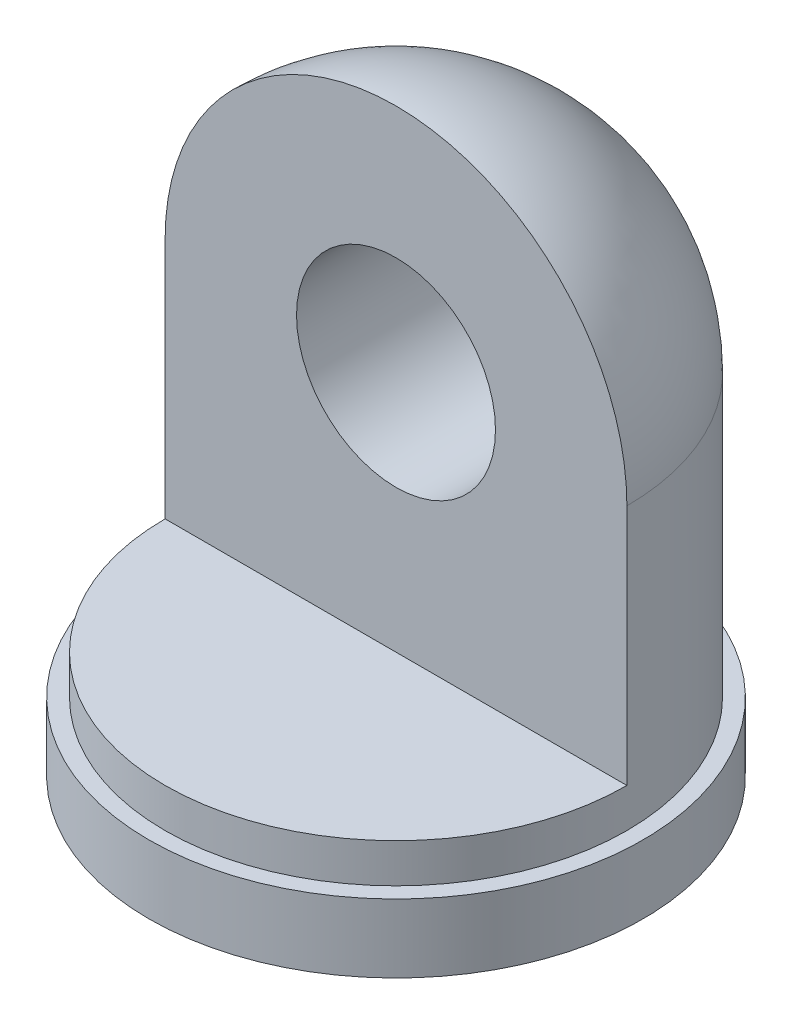
ISO-10303-21;
HEADER;
FILE_DESCRIPTION(('STEP AP214'),'2;1');
FILE_NAME('part.step','',(''),(''),'','','');
FILE_SCHEMA(('AUTOMOTIVE_DESIGN { 1 0 10303 214 1 1 1 1 }'));
ENDSEC;
DATA;
#1=APPLICATION_CONTEXT('core data for automotive mechanical design processes');
#2=APPLICATION_PROTOCOL_DEFINITION('international standard','automotive_design',2000,#1);
#3=PRODUCT_CONTEXT('',#1,'mechanical');
#4=PRODUCT('Part','Part','',(#3));
#5=PRODUCT_RELATED_PRODUCT_CATEGORY('part','',(#4));
#6=PRODUCT_DEFINITION_FORMATION('','',#4);
#7=PRODUCT_DEFINITION_CONTEXT('part definition',#1,'design');
#8=PRODUCT_DEFINITION('design','',#6,#7);
#9=PRODUCT_DEFINITION_SHAPE('','',#8);
#10=(LENGTH_UNIT() NAMED_UNIT(*) SI_UNIT(.MILLI.,.METRE.));
#11=(NAMED_UNIT(*) PLANE_ANGLE_UNIT() SI_UNIT($,.RADIAN.));
#12=(NAMED_UNIT(*) SI_UNIT($,.STERADIAN.) SOLID_ANGLE_UNIT());
#13=UNCERTAINTY_MEASURE_WITH_UNIT(LENGTH_MEASURE(1.E-05),#10,'distance_accuracy_value','');
#14=(GEOMETRIC_REPRESENTATION_CONTEXT(3) GLOBAL_UNCERTAINTY_ASSIGNED_CONTEXT((#13)) GLOBAL_UNIT_ASSIGNED_CONTEXT((#10,
#11,#12)) REPRESENTATION_CONTEXT('',''));
#15=CARTESIAN_POINT('',(0.,0.,0.));
#16=DIRECTION('',(0.,0.,1.));
#17=DIRECTION('',(1.,0.,0.));
#18=AXIS2_PLACEMENT_3D('',#15,#16,#17);
#19=CARTESIAN_POINT('',(0.,12.2932693034272,0.));
#20=DIRECTION('',(0.,1.,0.));
#21=DIRECTION('',(0.,0.,1.));
#22=AXIS2_PLACEMENT_3D('',#19,#20,#21);
#23=CYLINDRICAL_SURFACE('',#22,6.);
#24=CARTESIAN_POINT('',(2.58487319345415,6.29326930342722,-5.41464962613114));
#25=CARTESIAN_POINT('',(2.5848840410391,6.22424858018242,-5.41463377199758));
#26=CARTESIAN_POINT('',(2.58210904828782,6.15523652136865,-5.41596894936315));
#27=CARTESIAN_POINT('',(2.57107232171774,6.01778124345002,-5.42122265093839));
#28=CARTESIAN_POINT('',(2.56281301861613,5.94933778593468,-5.42514003067699));
#29=CARTESIAN_POINT('',(2.54094113834099,5.81381070570679,-5.43541674978779));
#30=CARTESIAN_POINT('',(2.52735249319485,5.74672239450183,-5.44176516932781));
#31=CARTESIAN_POINT('',(2.49498189353482,5.61407765387016,-5.45668230331635));
#32=CARTESIAN_POINT('',(2.47619954852882,5.54852134002988,-5.46525118470886));
#33=CARTESIAN_POINT('',(2.41238215227121,5.35498387763034,-5.49386967397398));
#34=CARTESIAN_POINT('',(2.35982624648252,5.2298266257317,-5.51685639491123));
#35=CARTESIAN_POINT('',(2.2363827259697,4.99003901975938,-5.56803706560118));
#36=CARTESIAN_POINT('',(2.16547452046273,4.87542068710021,-5.59623685405351));
#37=CARTESIAN_POINT('',(2.0023514088534,4.6524307139157,-5.65672946665363));
#38=CARTESIAN_POINT('',(1.90911532601506,4.5448434496154,-5.68916624477941));
#39=CARTESIAN_POINT('',(1.70614103023118,4.34626565715367,-5.75329509527709));
#40=CARTESIAN_POINT('',(1.59639915713031,4.25527882006174,-5.78498700066679));
#41=CARTESIAN_POINT('',(1.35718295533805,4.08830400020744,-5.84585056834115));
#42=CARTESIAN_POINT('',(1.22702334567552,4.01322264251166,-5.87483361089336));
#43=CARTESIAN_POINT('',(0.954445590874337,3.88636908924252,-5.92521695380403));
#44=CARTESIAN_POINT('',(0.812033323049155,3.83458579157461,-5.94662086476603));
#45=CARTESIAN_POINT('',(0.527327249450271,3.75871129120959,-5.97840237800325));
#46=CARTESIAN_POINT('',(0.385460584817764,3.73324963072621,-5.98932327199135));
#47=CARTESIAN_POINT('',(0.0990742136641104,3.70629920036736,-6.00089048993073));
#48=CARTESIAN_POINT('',(-0.0454443598204628,3.70480042051561,-6.00154110406835));
#49=CARTESIAN_POINT('',(-0.323014067783129,3.72513069346394,-5.99280425769664));
#50=CARTESIAN_POINT('',(-0.456200150087038,3.74545026036471,-5.98406631198313));
#51=CARTESIAN_POINT('',(-0.717053911297214,3.80623456379425,-5.95844074933576));
#52=CARTESIAN_POINT('',(-0.844721281432467,3.84670042592341,-5.94155267704506));
#53=CARTESIAN_POINT('',(-1.09327832274163,3.9470895272948,-5.90092010836288));
#54=CARTESIAN_POINT('',(-1.21403435085097,4.00730109169824,-5.87707462723402));
#55=CARTESIAN_POINT('',(-1.44404792068695,4.1451788378233,-5.82483114306816));
#56=CARTESIAN_POINT('',(-1.55330115050488,4.22285153101315,-5.7964314428427));
#57=CARTESIAN_POINT('',(-1.76586685162216,4.40016587287919,-5.73540220447574));
#58=CARTESIAN_POINT('',(-1.86812936916187,4.50101356623946,-5.70261516897747));
#59=CARTESIAN_POINT('',(-2.0547768350895,4.71846629078323,-5.63805531104916));
#60=CARTESIAN_POINT('',(-2.1391518137535,4.83508005029034,-5.60628306255109));
#61=CARTESIAN_POINT('',(-2.29061845889676,5.08623015576656,-5.5461671427034));
#62=CARTESIAN_POINT('',(-2.35693845175716,5.22127650746231,-5.51799792851949));
#63=CARTESIAN_POINT('',(-2.46538636243553,5.50207627564986,-5.47041338501155));
#64=CARTESIAN_POINT('',(-2.50756056017947,5.64780860127627,-5.45098132475776));
#65=CARTESIAN_POINT('',(-2.55266760594347,5.87806786165184,-5.42993422919482));
#66=CARTESIAN_POINT('',(-2.56472041746477,5.96053329271925,-5.42423612340741));
#67=CARTESIAN_POINT('',(-2.58082861822633,6.1264026475209,-5.41658142561293));
#68=CARTESIAN_POINT('',(-2.5848848140309,6.20980647575186,-5.41462445626345));
#69=CARTESIAN_POINT('',(-2.58487319345415,6.29326930342722,-5.41464962613114));
#70=B_SPLINE_CURVE_WITH_KNOTS('',3,(#24,#25,#26,#27,#28,#29,#30,#31,#32,#33,#34,#35,#36,#37,#38,
#39,#40,#41,#42,#43,#44,#45,#46,#47,#48,#49,#50,#51,#52,#53,#54,#55,#56,#57,#58,#59,#60,#61,#62,
#63,#64,#65,#66,#67,#68,#69),.UNSPECIFIED.,.F.,.F.,(4,2,2,2,2,2,2,2,2,2,2,2,2,2,2,2,2,2,2,2,2,2,
4),(0.,0.206979139837886,0.413866605023873,0.619835464324268,0.825819813756001,1.23686214291858,
1.64836766487108,2.0845006846086,2.52073055972405,2.97747599919997,3.43400355719699,
3.86533827417413,4.2964928056714,4.69963144163562,5.10279260402143,5.51212434384899,
5.92160898244336,6.36161836629248,6.80187235090698,7.25872710265807,7.71470324996145,
7.96488473655777,8.21504098775574),.UNSPECIFIED.);
#71=CARTESIAN_POINT('',(2.58487319345415,6.29326930342722,-5.41464962613114));
#72=VERTEX_POINT('',#71);
#73=CARTESIAN_POINT('',(-2.58487319345415,6.29326930342722,-5.41464962613114));
#74=VERTEX_POINT('',#73);
#75=EDGE_CURVE('E48',#72,#74,#70,.T.);
#76=ORIENTED_EDGE('',*,*,#75,.F.);
#77=CARTESIAN_POINT('',(0.,6.29326930342722,0.));
#78=DIRECTION('',(0.,1.,0.));
#79=DIRECTION('',(0.,0.,1.));
#80=AXIS2_PLACEMENT_3D('',#77,#78,#79);
#81=CIRCLE('',#80,6.);
#82=CARTESIAN_POINT('',(6.,6.29326930342722,0.));
#83=VERTEX_POINT('',#82);
#84=EDGE_CURVE('E11',#83,#72,#81,.T.);
#85=ORIENTED_EDGE('',*,*,#84,.F.);
#86=DIRECTION('',(0.,-1.,0.));
#87=VECTOR('',#86,1.);
#88=CARTESIAN_POINT('',(6.,0.,0.));
#89=LINE('',#88,#87);
#90=CARTESIAN_POINT('',(6.,0.,0.));
#91=VERTEX_POINT('',#90);
#92=EDGE_CURVE('E56',#83,#91,#89,.T.);
#93=ORIENTED_EDGE('',*,*,#92,.T.);
#94=CARTESIAN_POINT('',(0.,0.,0.));
#95=DIRECTION('',(0.,-1.,0.));
#96=DIRECTION('',(0.,0.,-1.));
#97=AXIS2_PLACEMENT_3D('',#94,#95,#96);
#98=CIRCLE('',#97,6.);
#99=CARTESIAN_POINT('',(-6.,0.,0.));
#100=VERTEX_POINT('',#99);
#101=EDGE_CURVE('E100',#91,#100,#98,.T.);
#102=ORIENTED_EDGE('',*,*,#101,.T.);
#103=DIRECTION('',(0.,-1.,0.));
#104=VECTOR('',#103,1.);
#105=CARTESIAN_POINT('',(-6.,0.,0.));
#106=LINE('',#105,#104);
#107=CARTESIAN_POINT('',(-6.,6.29326930342722,0.));
#108=VERTEX_POINT('',#107);
#109=EDGE_CURVE('E91',#108,#100,#106,.T.);
#110=ORIENTED_EDGE('',*,*,#109,.F.);
#111=EDGE_CURVE('E41',#74,#108,#81,.T.);
#112=ORIENTED_EDGE('',*,*,#111,.F.);
#113=EDGE_LOOP('',(#76,#85,#93,#102,#110,#112));
#114=FACE_BOUND('',#113,.T.);
#115=CARTESIAN_POINT('',(0.,-1.016,0.));
#116=DIRECTION('',(0.,-1.,0.));
#117=DIRECTION('',(0.,0.,-1.));
#118=AXIS2_PLACEMENT_3D('',#115,#116,#117);
#119=CIRCLE('',#118,6.);
#120=CARTESIAN_POINT('',(0.,-1.016,-6.));
#121=VERTEX_POINT('',#120);
#122=EDGE_CURVE('E98',#121,#121,#119,.T.);
#123=ORIENTED_EDGE('',*,*,#122,.F.);
#124=EDGE_LOOP('',(#123));
#125=FACE_BOUND('',#124,.T.);
#126=ADVANCED_FACE('F32',(#114,#125),#23,.T.);
#127=CARTESIAN_POINT('',(0.,6.29326930342722,0.));
#128=DIRECTION('',(0.,1.,0.));
#129=DIRECTION('',(1.,0.,0.));
#130=AXIS2_PLACEMENT_3D('',#127,#128,#129);
#131=SPHERICAL_SURFACE('',#130,6.);
#132=CARTESIAN_POINT('',(0.,6.29326930342722,-5.41464962613114));
#133=DIRECTION('',(0.,0.,1.));
#134=DIRECTION('',(1.,0.,0.));
#135=AXIS2_PLACEMENT_3D('',#132,#133,#134);
#136=CIRCLE('',#135,2.58487319345415);
#137=EDGE_CURVE('E67',#74,#72,#136,.F.);
#138=ORIENTED_EDGE('',*,*,#137,.F.);
#139=ORIENTED_EDGE('',*,*,#111,.T.);
#140=CARTESIAN_POINT('',(0.,6.29326930342722,0.));
#141=DIRECTION('',(0.,0.,-1.));
#142=DIRECTION('',(1.,0.,0.));
#143=AXIS2_PLACEMENT_3D('',#140,#141,#142);
#144=CIRCLE('',#143,6.);
#145=EDGE_CURVE('E81',#108,#83,#144,.T.);
#146=ORIENTED_EDGE('',*,*,#145,.T.);
#147=ORIENTED_EDGE('',*,*,#84,.T.);
#148=EDGE_LOOP('',(#138,#139,#146,#147));
#149=FACE_BOUND('',#148,.T.);
#150=ADVANCED_FACE('F79',(#149),#131,.T.);
#151=CARTESIAN_POINT('',(0.,6.29326930342722,0.));
#152=DIRECTION('',(0.,0.,1.));
#153=DIRECTION('',(1.,0.,0.));
#154=AXIS2_PLACEMENT_3D('',#151,#152,#153);
#155=PLANE('',#154);
#156=CARTESIAN_POINT('',(0.,6.29326930342722,0.));
#157=DIRECTION('',(0.,0.,1.));
#158=DIRECTION('',(1.,0.,0.));
#159=AXIS2_PLACEMENT_3D('',#156,#157,#158);
#160=CIRCLE('',#159,2.58487319345415);
#161=CARTESIAN_POINT('',(2.58487319345415,6.29326930342722,0.));
#162=VERTEX_POINT('',#161);
#163=EDGE_CURVE('E72',#162,#162,#160,.T.);
#164=ORIENTED_EDGE('',*,*,#163,.F.);
#165=EDGE_LOOP('',(#164));
#166=FACE_BOUND('',#165,.T.);
#167=DIRECTION('',(-1.,0.,0.));
#168=VECTOR('',#167,1.);
#169=CARTESIAN_POINT('',(6.,0.,0.));
#170=LINE('',#169,#168);
#171=EDGE_CURVE('E83',#91,#100,#170,.T.);
#172=ORIENTED_EDGE('',*,*,#171,.F.);
#173=ORIENTED_EDGE('',*,*,#92,.F.);
#174=ORIENTED_EDGE('',*,*,#145,.F.);
#175=ORIENTED_EDGE('',*,*,#109,.T.);
#176=EDGE_LOOP('',(#172,#173,#174,#175));
#177=FACE_BOUND('',#176,.T.);
#178=ADVANCED_FACE('F85',(#166,#177),#155,.T.);
#179=CARTESIAN_POINT('',(0.,0.,0.));
#180=DIRECTION('',(0.,-1.,0.));
#181=DIRECTION('',(0.,0.,-1.));
#182=AXIS2_PLACEMENT_3D('',#179,#180,#181);
#183=PLANE('',#182);
#184=ORIENTED_EDGE('',*,*,#101,.F.);
#185=ORIENTED_EDGE('',*,*,#171,.T.);
#186=EDGE_LOOP('',(#184,#185));
#187=FACE_BOUND('',#186,.T.);
#188=ADVANCED_FACE('F127',(#187),#183,.F.);
#189=CARTESIAN_POINT('',(0.,-2.794,0.));
#190=DIRECTION('',(0.,1.,0.));
#191=DIRECTION('',(0.,0.,1.));
#192=AXIS2_PLACEMENT_3D('',#189,#190,#191);
#193=CYLINDRICAL_SURFACE('',#192,6.41903994464937);
#194=CARTESIAN_POINT('',(0.,-2.794,0.));
#195=DIRECTION('',(0.,-1.,0.));
#196=DIRECTION('',(0.,0.,-1.));
#197=AXIS2_PLACEMENT_3D('',#194,#195,#196);
#198=CIRCLE('',#197,6.41903994464937);
#199=CARTESIAN_POINT('',(0.,-2.794,-6.41903994464937));
#200=VERTEX_POINT('',#199);
#201=EDGE_CURVE('E104',#200,#200,#198,.T.);
#202=ORIENTED_EDGE('',*,*,#201,.F.);
#203=EDGE_LOOP('',(#202));
#204=FACE_BOUND('',#203,.T.);
#205=CARTESIAN_POINT('',(0.,-1.016,0.));
#206=DIRECTION('',(0.,-1.,0.));
#207=DIRECTION('',(0.,0.,-1.));
#208=AXIS2_PLACEMENT_3D('',#205,#206,#207);
#209=CIRCLE('',#208,6.41903994464937);
#210=CARTESIAN_POINT('',(0.,-1.016,-6.41903994464937));
#211=VERTEX_POINT('',#210);
#212=EDGE_CURVE('E77',#211,#211,#209,.T.);
#213=ORIENTED_EDGE('',*,*,#212,.T.);
#214=EDGE_LOOP('',(#213));
#215=FACE_BOUND('',#214,.T.);
#216=ADVANCED_FACE('F121',(#204,#215),#193,.T.);
#217=CARTESIAN_POINT('',(0.,-2.794,0.));
#218=DIRECTION('',(0.,-1.,0.));
#219=DIRECTION('',(0.,0.,-1.));
#220=AXIS2_PLACEMENT_3D('',#217,#218,#219);
#221=PLANE('',#220);
#222=ORIENTED_EDGE('',*,*,#201,.T.);
#223=EDGE_LOOP('',(#222));
#224=FACE_BOUND('',#223,.T.);
#225=ADVANCED_FACE('F118',(#224),#221,.T.);
#226=CARTESIAN_POINT('',(0.,-1.016,0.));
#227=DIRECTION('',(0.,-1.,0.));
#228=DIRECTION('',(0.,0.,-1.));
#229=AXIS2_PLACEMENT_3D('',#226,#227,#228);
#230=PLANE('',#229);
#231=ORIENTED_EDGE('',*,*,#122,.T.);
#232=EDGE_LOOP('',(#231));
#233=FACE_BOUND('',#232,.T.);
#234=ORIENTED_EDGE('',*,*,#212,.F.);
#235=EDGE_LOOP('',(#234));
#236=FACE_BOUND('',#235,.T.);
#237=ADVANCED_FACE('F117',(#233,#236),#230,.F.);
#238=CARTESIAN_POINT('',(0.,6.29326930342722,-6.41903994464937));
#239=DIRECTION('',(0.,0.,1.));
#240=DIRECTION('',(1.,0.,0.));
#241=AXIS2_PLACEMENT_3D('',#238,#239,#240);
#242=CYLINDRICAL_SURFACE('',#241,2.58487319345415);
#243=ORIENTED_EDGE('',*,*,#75,.T.);
#244=ORIENTED_EDGE('',*,*,#137,.T.);
#245=EDGE_LOOP('',(#243,#244));
#246=FACE_BOUND('',#245,.T.);
#247=ORIENTED_EDGE('',*,*,#163,.T.);
#248=EDGE_LOOP('',(#247));
#249=FACE_BOUND('',#248,.T.);
#250=ADVANCED_FACE('F68',(#246,#249),#242,.F.);
#251=CLOSED_SHELL('',(#126,#150,#178,#188,#216,#225,#237,#250));
#252=MANIFOLD_SOLID_BREP('B2',#251);
#253=ADVANCED_BREP_SHAPE_REPRESENTATION('',(#18,#252),#14);
#254=SHAPE_DEFINITION_REPRESENTATION(#9,#253);
ENDSEC;
END-ISO-10303-21;
